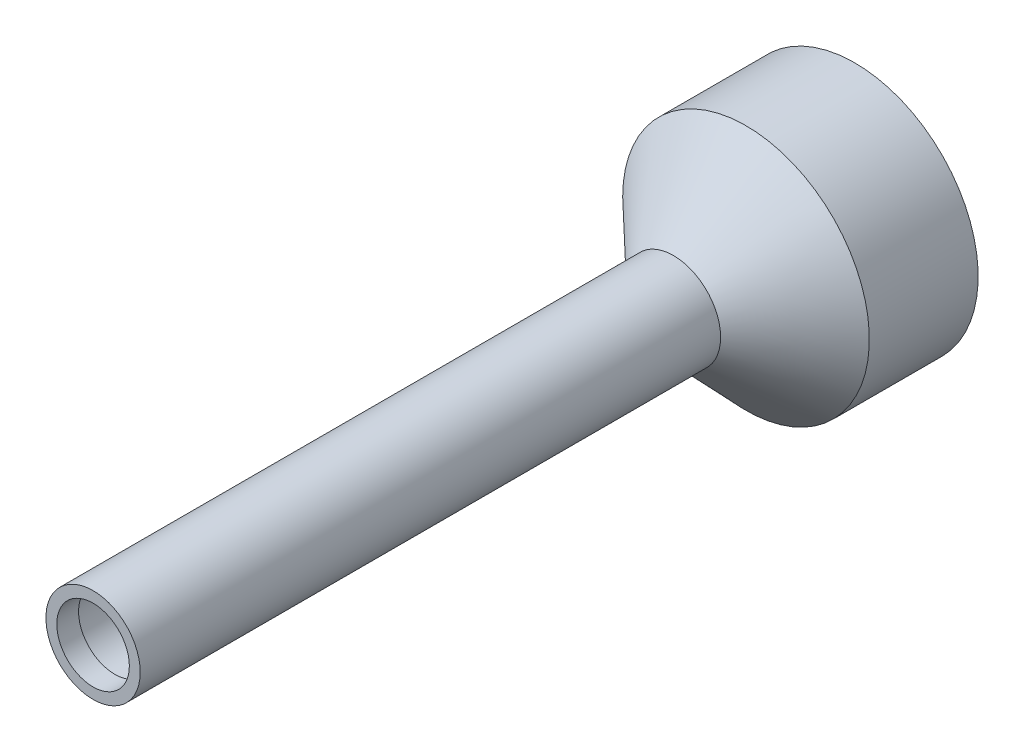
ISO-10303-21;
HEADER;
FILE_DESCRIPTION(('STEP AP214'),'2;1');
FILE_NAME('part.step','',(''),(''),'','','');
FILE_SCHEMA(('AUTOMOTIVE_DESIGN { 1 0 10303 214 1 1 1 1 }'));
ENDSEC;
DATA;
#1=APPLICATION_CONTEXT('core data for automotive mechanical design processes');
#2=APPLICATION_PROTOCOL_DEFINITION('international standard','automotive_design',2000,#1);
#3=PRODUCT_CONTEXT('',#1,'mechanical');
#4=PRODUCT('Part','Part','',(#3));
#5=PRODUCT_RELATED_PRODUCT_CATEGORY('part','',(#4));
#6=PRODUCT_DEFINITION_FORMATION('','',#4);
#7=PRODUCT_DEFINITION_CONTEXT('part definition',#1,'design');
#8=PRODUCT_DEFINITION('design','',#6,#7);
#9=PRODUCT_DEFINITION_SHAPE('','',#8);
#10=(LENGTH_UNIT() NAMED_UNIT(*) SI_UNIT(.MILLI.,.METRE.));
#11=(NAMED_UNIT(*) PLANE_ANGLE_UNIT() SI_UNIT($,.RADIAN.));
#12=(NAMED_UNIT(*) SI_UNIT($,.STERADIAN.) SOLID_ANGLE_UNIT());
#13=UNCERTAINTY_MEASURE_WITH_UNIT(LENGTH_MEASURE(1.E-05),#10,'distance_accuracy_value','');
#14=(GEOMETRIC_REPRESENTATION_CONTEXT(3) GLOBAL_UNCERTAINTY_ASSIGNED_CONTEXT((#13)) GLOBAL_UNIT_ASSIGNED_CONTEXT((#10,
#11,#12)) REPRESENTATION_CONTEXT('',''));
#15=CARTESIAN_POINT('',(0.,0.,0.));
#16=DIRECTION('',(0.,0.,1.));
#17=DIRECTION('',(1.,0.,0.));
#18=AXIS2_PLACEMENT_3D('',#15,#16,#17);
#19=CARTESIAN_POINT('',(0.,0.,90.));
#20=DIRECTION('',(0.,0.,-1.));
#21=DIRECTION('',(-1.,0.,0.));
#22=AXIS2_PLACEMENT_3D('',#19,#20,#21);
#23=CYLINDRICAL_SURFACE('',#22,5.);
#24=CARTESIAN_POINT('',(0.,0.,90.));
#25=DIRECTION('',(0.,0.,1.));
#26=DIRECTION('',(1.,0.,0.));
#27=AXIS2_PLACEMENT_3D('',#24,#25,#26);
#28=CIRCLE('',#27,5.);
#29=CARTESIAN_POINT('',(5.,0.,90.));
#30=VERTEX_POINT('',#29);
#31=EDGE_CURVE('E56',#30,#30,#28,.T.);
#32=ORIENTED_EDGE('',*,*,#31,.T.);
#33=EDGE_LOOP('',(#32));
#34=FACE_BOUND('',#33,.T.);
#35=CARTESIAN_POINT('',(0.,0.,87.));
#36=DIRECTION('',(0.,0.,-1.));
#37=DIRECTION('',(-1.,0.,0.));
#38=AXIS2_PLACEMENT_3D('',#35,#36,#37);
#39=CIRCLE('',#38,5.);
#40=CARTESIAN_POINT('',(-5.,0.,87.));
#41=VERTEX_POINT('',#40);
#42=EDGE_CURVE('E63',#41,#41,#39,.T.);
#43=ORIENTED_EDGE('',*,*,#42,.T.);
#44=EDGE_LOOP('',(#43));
#45=FACE_BOUND('',#44,.T.);
#46=ADVANCED_FACE('F39',(#34,#45),#23,.F.);
#47=CARTESIAN_POINT('',(0.,0.,10.));
#48=DIRECTION('',(0.,0.,-1.));
#49=DIRECTION('',(-1.,0.,0.));
#50=AXIS2_PLACEMENT_3D('',#47,#48,#49);
#51=CONICAL_SURFACE('',#50,6.5,0.809783572570167);
#52=CARTESIAN_POINT('',(0.,0.,0.));
#53=DIRECTION('',(0.,0.,-1.));
#54=DIRECTION('',(-1.,0.,0.));
#55=AXIS2_PLACEMENT_3D('',#52,#53,#54);
#56=CIRCLE('',#55,17.);
#57=CARTESIAN_POINT('',(-17.,0.,0.));
#58=VERTEX_POINT('',#57);
#59=EDGE_CURVE('E88',#58,#58,#56,.T.);
#60=ORIENTED_EDGE('',*,*,#59,.F.);
#61=EDGE_LOOP('',(#60));
#62=FACE_BOUND('',#61,.T.);
#63=CARTESIAN_POINT('',(0.,0.,10.));
#64=DIRECTION('',(0.,0.,1.));
#65=DIRECTION('',(1.,0.,0.));
#66=AXIS2_PLACEMENT_3D('',#63,#64,#65);
#67=CIRCLE('',#66,6.5);
#68=CARTESIAN_POINT('',(6.5,0.,10.));
#69=VERTEX_POINT('',#68);
#70=EDGE_CURVE('E11',#69,#69,#67,.T.);
#71=ORIENTED_EDGE('',*,*,#70,.F.);
#72=EDGE_LOOP('',(#71));
#73=FACE_BOUND('',#72,.T.);
#74=ADVANCED_FACE('F41',(#62,#73),#51,.T.);
#75=CARTESIAN_POINT('',(0.,0.,90.));
#76=DIRECTION('',(0.,0.,1.));
#77=DIRECTION('',(1.,0.,0.));
#78=AXIS2_PLACEMENT_3D('',#75,#76,#77);
#79=PLANE('',#78);
#80=CARTESIAN_POINT('',(0.,0.,90.));
#81=DIRECTION('',(0.,0.,1.));
#82=DIRECTION('',(1.,0.,0.));
#83=AXIS2_PLACEMENT_3D('',#80,#81,#82);
#84=CIRCLE('',#83,6.5);
#85=CARTESIAN_POINT('',(6.5,0.,90.));
#86=VERTEX_POINT('',#85);
#87=EDGE_CURVE('E49',#86,#86,#84,.T.);
#88=ORIENTED_EDGE('',*,*,#87,.T.);
#89=EDGE_LOOP('',(#88));
#90=FACE_BOUND('',#89,.T.);
#91=ORIENTED_EDGE('',*,*,#31,.F.);
#92=EDGE_LOOP('',(#91));
#93=FACE_BOUND('',#92,.T.);
#94=ADVANCED_FACE('F150',(#90,#93),#79,.T.);
#95=CARTESIAN_POINT('',(0.,0.,90.));
#96=DIRECTION('',(0.,0.,-1.));
#97=DIRECTION('',(-1.,0.,0.));
#98=AXIS2_PLACEMENT_3D('',#95,#96,#97);
#99=CYLINDRICAL_SURFACE('',#98,6.5);
#100=ORIENTED_EDGE('',*,*,#87,.F.);
#101=EDGE_LOOP('',(#100));
#102=FACE_BOUND('',#101,.T.);
#103=ORIENTED_EDGE('',*,*,#70,.T.);
#104=EDGE_LOOP('',(#103));
#105=FACE_BOUND('',#104,.T.);
#106=ADVANCED_FACE('F145',(#102,#105),#99,.T.);
#107=CARTESIAN_POINT('',(0.,0.,7.82758620689655));
#108=DIRECTION('',(0.,0.,-1.));
#109=DIRECTION('',(-1.,0.,0.));
#110=AXIS2_PLACEMENT_3D('',#107,#108,#109);
#111=CONICAL_SURFACE('',#110,4.43103448275862,0.809783572570167);
#112=CARTESIAN_POINT('',(0.,0.,0.));
#113=DIRECTION('',(0.,0.,1.));
#114=DIRECTION('',(1.,0.,0.));
#115=AXIS2_PLACEMENT_3D('',#112,#113,#114);
#116=CIRCLE('',#115,12.65);
#117=CARTESIAN_POINT('',(12.65,0.,0.));
#118=VERTEX_POINT('',#117);
#119=EDGE_CURVE('E93',#118,#118,#116,.T.);
#120=ORIENTED_EDGE('',*,*,#119,.F.);
#121=EDGE_LOOP('',(#120));
#122=FACE_BOUND('',#121,.T.);
#123=CARTESIAN_POINT('',(0.,0.,7.));
#124=DIRECTION('',(0.,0.,-1.));
#125=DIRECTION('',(-1.,0.,0.));
#126=AXIS2_PLACEMENT_3D('',#123,#124,#125);
#127=CIRCLE('',#126,5.3);
#128=CARTESIAN_POINT('',(-5.3,0.,7.));
#129=VERTEX_POINT('',#128);
#130=EDGE_CURVE('E97',#129,#129,#127,.T.);
#131=ORIENTED_EDGE('',*,*,#130,.F.);
#132=EDGE_LOOP('',(#131));
#133=FACE_BOUND('',#132,.T.);
#134=ADVANCED_FACE('F141',(#122,#133),#111,.F.);
#135=CARTESIAN_POINT('',(0.,0.,87.));
#136=DIRECTION('',(0.,0.,-1.));
#137=DIRECTION('',(-1.,0.,0.));
#138=AXIS2_PLACEMENT_3D('',#135,#136,#137);
#139=CYLINDRICAL_SURFACE('',#138,5.3);
#140=CARTESIAN_POINT('',(0.,0.,87.));
#141=DIRECTION('',(0.,0.,-1.));
#142=DIRECTION('',(-1.,0.,0.));
#143=AXIS2_PLACEMENT_3D('',#140,#141,#142);
#144=CIRCLE('',#143,5.3);
#145=CARTESIAN_POINT('',(-5.3,0.,87.));
#146=VERTEX_POINT('',#145);
#147=EDGE_CURVE('E101',#146,#146,#144,.T.);
#148=ORIENTED_EDGE('',*,*,#147,.F.);
#149=EDGE_LOOP('',(#148));
#150=FACE_BOUND('',#149,.T.);
#151=ORIENTED_EDGE('',*,*,#130,.T.);
#152=EDGE_LOOP('',(#151));
#153=FACE_BOUND('',#152,.T.);
#154=ADVANCED_FACE('F137',(#150,#153),#139,.F.);
#155=CARTESIAN_POINT('',(0.,0.,87.));
#156=DIRECTION('',(0.,0.,-1.));
#157=DIRECTION('',(-1.,0.,0.));
#158=AXIS2_PLACEMENT_3D('',#155,#156,#157);
#159=PLANE('',#158);
#160=ORIENTED_EDGE('',*,*,#42,.F.);
#161=EDGE_LOOP('',(#160));
#162=FACE_BOUND('',#161,.T.);
#163=ORIENTED_EDGE('',*,*,#147,.T.);
#164=EDGE_LOOP('',(#163));
#165=FACE_BOUND('',#164,.T.);
#166=ADVANCED_FACE('F134',(#162,#165),#159,.T.);
#167=CARTESIAN_POINT('',(0.,0.,-15.));
#168=DIRECTION('',(0.,0.,-1.));
#169=DIRECTION('',(-1.,0.,0.));
#170=AXIS2_PLACEMENT_3D('',#167,#168,#169);
#171=PLANE('',#170);
#172=CARTESIAN_POINT('',(0.,0.,-15.));
#173=DIRECTION('',(0.,0.,-1.));
#174=DIRECTION('',(-1.,0.,0.));
#175=AXIS2_PLACEMENT_3D('',#172,#173,#174);
#176=CIRCLE('',#175,17.);
#177=CARTESIAN_POINT('',(-17.,0.,-15.));
#178=VERTEX_POINT('',#177);
#179=EDGE_CURVE('E102',#178,#178,#176,.T.);
#180=ORIENTED_EDGE('',*,*,#179,.T.);
#181=EDGE_LOOP('',(#180));
#182=FACE_BOUND('',#181,.T.);
#183=CARTESIAN_POINT('',(0.,0.,-15.));
#184=DIRECTION('',(0.,0.,-1.));
#185=DIRECTION('',(-1.,0.,0.));
#186=AXIS2_PLACEMENT_3D('',#183,#184,#185);
#187=CIRCLE('',#186,12.65);
#188=CARTESIAN_POINT('',(-12.65,0.,-15.));
#189=VERTEX_POINT('',#188);
#190=EDGE_CURVE('E109',#189,#189,#187,.T.);
#191=ORIENTED_EDGE('',*,*,#190,.F.);
#192=EDGE_LOOP('',(#191));
#193=FACE_BOUND('',#192,.T.);
#194=ADVANCED_FACE('F131',(#182,#193),#171,.T.);
#195=CARTESIAN_POINT('',(0.,0.,-15.));
#196=DIRECTION('',(0.,0.,1.));
#197=DIRECTION('',(1.,0.,0.));
#198=AXIS2_PLACEMENT_3D('',#195,#196,#197);
#199=CYLINDRICAL_SURFACE('',#198,17.);
#200=ORIENTED_EDGE('',*,*,#179,.F.);
#201=EDGE_LOOP('',(#200));
#202=FACE_BOUND('',#201,.T.);
#203=ORIENTED_EDGE('',*,*,#59,.T.);
#204=EDGE_LOOP('',(#203));
#205=FACE_BOUND('',#204,.T.);
#206=ADVANCED_FACE('F120',(#202,#205),#199,.T.);
#207=CARTESIAN_POINT('',(0.,0.,-15.));
#208=DIRECTION('',(0.,0.,1.));
#209=DIRECTION('',(1.,0.,0.));
#210=AXIS2_PLACEMENT_3D('',#207,#208,#209);
#211=CYLINDRICAL_SURFACE('',#210,12.65);
#212=ORIENTED_EDGE('',*,*,#190,.T.);
#213=EDGE_LOOP('',(#212));
#214=FACE_BOUND('',#213,.T.);
#215=ORIENTED_EDGE('',*,*,#119,.T.);
#216=EDGE_LOOP('',(#215));
#217=FACE_BOUND('',#216,.T.);
#218=ADVANCED_FACE('F130',(#214,#217),#211,.F.);
#219=CLOSED_SHELL('',(#46,#74,#94,#106,#134,#154,#166,#194,#206,#218));
#220=MANIFOLD_SOLID_BREP('B2',#219);
#221=ADVANCED_BREP_SHAPE_REPRESENTATION('',(#18,#220),#14);
#222=SHAPE_DEFINITION_REPRESENTATION(#9,#221);
ENDSEC;
END-ISO-10303-21;
